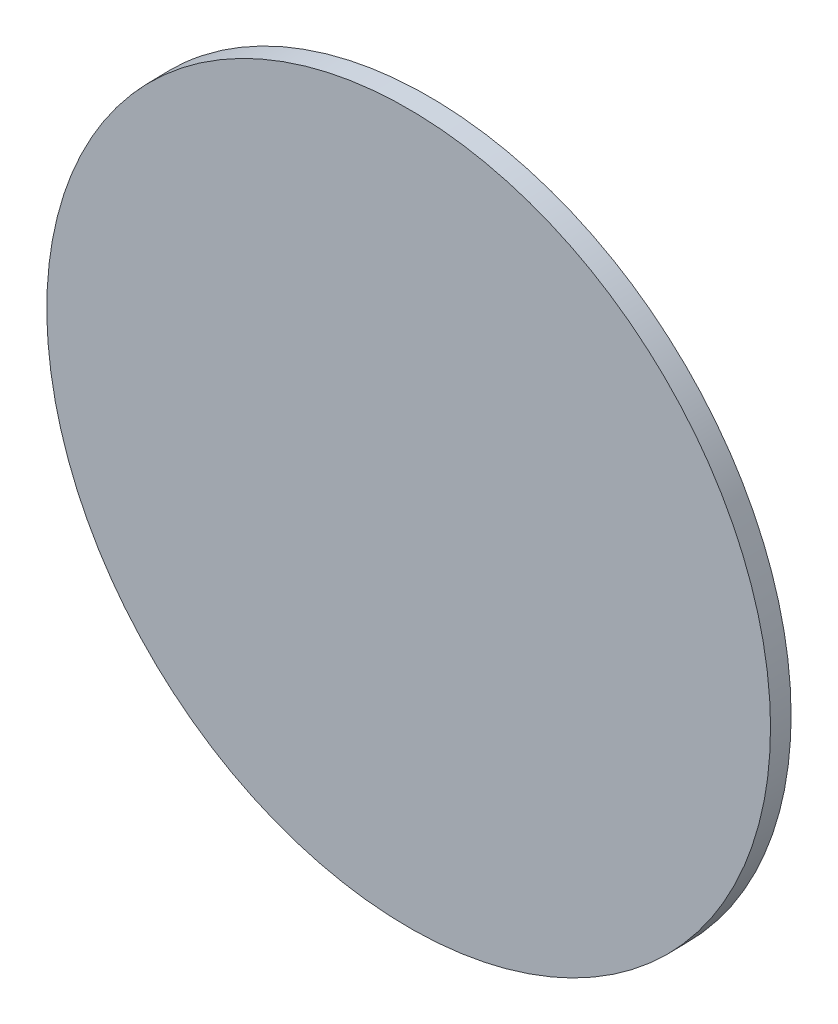
ISO-10303-21;
HEADER;
FILE_DESCRIPTION(('STEP AP214'),'2;1');
FILE_NAME('part.step','',(''),(''),'','','');
FILE_SCHEMA(('AUTOMOTIVE_DESIGN { 1 0 10303 214 1 1 1 1 }'));
ENDSEC;
DATA;
#1=APPLICATION_CONTEXT('core data for automotive mechanical design processes');
#2=APPLICATION_PROTOCOL_DEFINITION('international standard','automotive_design',2000,#1);
#3=PRODUCT_CONTEXT('',#1,'mechanical');
#4=PRODUCT('Part','Part','',(#3));
#5=PRODUCT_RELATED_PRODUCT_CATEGORY('part','',(#4));
#6=PRODUCT_DEFINITION_FORMATION('','',#4);
#7=PRODUCT_DEFINITION_CONTEXT('part definition',#1,'design');
#8=PRODUCT_DEFINITION('design','',#6,#7);
#9=PRODUCT_DEFINITION_SHAPE('','',#8);
#10=(LENGTH_UNIT() NAMED_UNIT(*) SI_UNIT(.MILLI.,.METRE.));
#11=(NAMED_UNIT(*) PLANE_ANGLE_UNIT() SI_UNIT($,.RADIAN.));
#12=(NAMED_UNIT(*) SI_UNIT($,.STERADIAN.) SOLID_ANGLE_UNIT());
#13=UNCERTAINTY_MEASURE_WITH_UNIT(LENGTH_MEASURE(1.E-05),#10,'distance_accuracy_value','');
#14=(GEOMETRIC_REPRESENTATION_CONTEXT(3) GLOBAL_UNCERTAINTY_ASSIGNED_CONTEXT((#13)) GLOBAL_UNIT_ASSIGNED_CONTEXT((#10,
#11,#12)) REPRESENTATION_CONTEXT('',''));
#15=CARTESIAN_POINT('',(0.,0.,0.));
#16=DIRECTION('',(0.,0.,1.));
#17=DIRECTION('',(1.,0.,0.));
#18=AXIS2_PLACEMENT_3D('',#15,#16,#17);
#19=CARTESIAN_POINT('',(85.7068958739331,-114.082851541454,61.8695362595294));
#20=CARTESIAN_POINT('',(86.9855501791155,-114.082715002272,61.8576769634676));
#21=CARTESIAN_POINT('',(89.5428587894805,-113.830574868088,61.836858182735));
#22=CARTESIAN_POINT('',(93.2314078014163,-112.711297905284,61.815529526912));
#23=CARTESIAN_POINT('',(96.6307940397738,-110.893967366935,61.8049200346468));
#24=CARTESIAN_POINT('',(99.6103809978107,-108.44842224646,61.8054374227773));
#25=CARTESIAN_POINT('',(102.055664819701,-105.46864347136,61.817061808368));
#26=CARTESIAN_POINT('',(103.872674619501,-102.069142268884,61.8393464727994));
#27=CARTESIAN_POINT('',(104.991583729595,-98.3805595637803,61.871435028915));
#28=CARTESIAN_POINT('',(105.369393100373,-94.5446455208251,61.9120943314986));
#29=CARTESIAN_POINT('',(104.991583729595,-90.7088121654839,61.959761866354));
#30=CARTESIAN_POINT('',(103.872674619501,-87.0204684224424,62.0126057968489));
#31=CARTESIAN_POINT('',(102.055664819701,-83.6213552732985,62.0685953603697));
#32=CARTESIAN_POINT('',(99.6103809978107,-80.6420987301293,62.1255789093895));
#33=CARTESIAN_POINT('',(96.6307940397738,-78.1971899511024,62.1813665980762));
#34=CARTESIAN_POINT('',(93.2314078014163,-76.3805854094754,62.2338145368398));
#35=CARTESIAN_POINT('',(89.5428587894805,-75.2620961990191,62.2809071808067));
#36=CARTESIAN_POINT('',(85.7068958739331,-74.8847052328356,62.320834786079));
#37=CARTESIAN_POINT('',(81.8709329583856,-75.262915434112,62.3520629571779));
#38=CARTESIAN_POINT('',(78.1823839464499,-76.3821923969159,62.3733916130009));
#39=CARTESIAN_POINT('',(74.7829977080924,-78.1995229352646,62.3840011052661));
#40=CARTESIAN_POINT('',(71.8034107500555,-80.64506805574,62.3834837171355));
#41=CARTESIAN_POINT('',(69.3581269281649,-83.6248468308397,62.3718593315449));
#42=CARTESIAN_POINT('',(67.541117128365,-87.024348033316,62.3495746671134));
#43=CARTESIAN_POINT('',(66.4222080182711,-90.7129307384197,62.3174861109978));
#44=CARTESIAN_POINT('',(66.0443986474928,-94.5488447813749,62.2768268084142));
#45=CARTESIAN_POINT('',(66.4222080182711,-98.3846781367161,62.2291592735589));
#46=CARTESIAN_POINT('',(67.541117128365,-102.073021879758,62.1763153430639));
#47=CARTESIAN_POINT('',(69.3581269281649,-105.472135028902,62.1203257795432));
#48=CARTESIAN_POINT('',(71.8034107500555,-108.451391572071,62.0633422305234));
#49=CARTESIAN_POINT('',(74.7829977080924,-110.896300351098,62.0075545418366));
#50=CARTESIAN_POINT('',(78.1823839464499,-112.712904892725,61.9551066030731));
#51=CARTESIAN_POINT('',(81.8709329583856,-113.831394103181,61.9080139591062));
#52=CARTESIAN_POINT('',(84.4282415687506,-114.082988080637,61.8813955555913));
#53=CARTESIAN_POINT('',(85.7068958739331,-114.082851541454,61.8695362595294));
#54=B_SPLINE_CURVE_WITH_KNOTS('',3,(#19,#20,#21,#22,#23,#24,#25,#26,#27,#28,#29,#30,#31,#32,#33,
#34,#35,#36,#37,#38,#39,#40,#41,#42,#43,#44,#45,#46,#47,#48,#49,#50,#51,#52,#53),.UNSPECIFIED.,
.T.,.F.,(4,1,1,1,1,1,1,1,1,1,1,1,1,1,1,1,1,1,1,1,1,1,1,1,1,1,1,1,1,1,1,1,4),(0.,0.03125,
0.0624999999999999,0.09375,0.125,0.15625,0.1875,0.21875,0.25,0.28125,0.3125,0.34375,0.375,
0.40625,0.4375,0.46875,0.5,0.53125,0.5625,0.59375,0.625,0.65625,0.6875,0.71875,0.75,0.78125,
0.8125,0.84375,0.875,0.90625,0.9375,0.96875,1.),.UNSPECIFIED.);
#55=DIRECTION('',(0.00927504161398903,-0.0115120037580994,0.999890717714957));
#56=VECTOR('',#55,1.);
#57=SURFACE_OF_LINEAR_EXTRUSION('',#54,#56);
#58=CARTESIAN_POINT('',(85.7068958739331,-114.082851541454,61.8695362595294));
#59=CARTESIAN_POINT('',(86.016874444642,-114.082818235632,61.8666612646174));
#60=CARTESIAN_POINT('',(86.3268509505105,-114.075384129447,61.8638714962122));
#61=CARTESIAN_POINT('',(86.946103894049,-114.045782949718,61.8584680777856));
#62=CARTESIAN_POINT('',(87.2553803263528,-114.023615763623,61.8558544291099));
#63=CARTESIAN_POINT('',(87.8725326212818,-113.964617041454,61.850808958023));
#64=CARTESIAN_POINT('',(88.1804084830238,-113.927785496135,61.8483771357264));
#65=CARTESIAN_POINT('',(88.7940613757493,-113.839528953054,61.8437009782443));
#66=CARTESIAN_POINT('',(89.0998384221305,-113.788104062473,61.8414566416819));
#67=CARTESIAN_POINT('',(89.7085911530925,-113.670721282911,61.8371612763618));
#68=CARTESIAN_POINT('',(90.0115668424944,-113.604763418947,61.8351102472712));
#69=CARTESIAN_POINT('',(90.6140397494619,-113.458506954127,61.8312055642477));
#70=CARTESIAN_POINT('',(90.9135369403105,-113.378208243204,61.8293519118299));
#71=CARTESIAN_POINT('',(91.5083810873808,-113.203476642742,61.8258458353011));
#72=CARTESIAN_POINT('',(91.8037280358141,-113.109043726682,61.8241934115677));
#73=CARTESIAN_POINT('',(92.3896005454006,-112.906249922882,61.8210936439426));
#74=CARTESIAN_POINT('',(92.6801261394355,-112.797889130174,61.8196462986517));
#75=CARTESIAN_POINT('',(93.2556774738459,-112.567431543691,61.8169607711952));
#76=CARTESIAN_POINT('',(93.5407032325866,-112.445334795794,61.815722588331));
#77=CARTESIAN_POINT('',(94.1046215391462,-112.187710669331,61.8134577449755));
#78=CARTESIAN_POINT('',(94.3835140414649,-112.052183191168,61.812431086053));
#79=CARTESIAN_POINT('',(94.9345487091208,-111.76803488667,61.8105911318546));
#80=CARTESIAN_POINT('',(95.2066908536853,-111.619414020049,61.8097778372352));
#81=CARTESIAN_POINT('',(95.7436065265374,-111.309411522335,61.8083665177128));
#82=CARTESIAN_POINT('',(96.0083800998016,-111.148029969154,61.8077684914955));
#83=CARTESIAN_POINT('',(96.5299302886891,-110.812825508086,61.8067898598582));
#84=CARTESIAN_POINT('',(96.7867069424623,-110.639002659565,61.8064092534009));
#85=CARTESIAN_POINT('',(97.2916908361091,-110.279322874428,61.8058660824521));
#86=CARTESIAN_POINT('',(97.5398980173427,-110.093465855489,61.8057035194525));
#87=CARTESIAN_POINT('',(98.0272055248016,-109.710172206982,61.8055961882347));
#88=CARTESIAN_POINT('',(98.2663058127553,-109.512735528759,61.8056514209317));
#89=CARTESIAN_POINT('',(98.734857249655,-109.106728394563,61.8059795783726));
#90=CARTESIAN_POINT('',(98.9643084489774,-108.898157996729,61.8062525019799));
#91=CARTESIAN_POINT('',(99.413008860506,-108.470319949354,61.8070161436525));
#92=CARTESIAN_POINT('',(99.6322581334334,-108.251052363497,61.8075068604213));
#93=CARTESIAN_POINT('',(100.060058216735,-107.802316705803,61.8087049743567));
#94=CARTESIAN_POINT('',(100.268608963416,-107.572848573252,61.809412372813));
#95=CARTESIAN_POINT('',(100.674575505975,-107.104264683341,61.8110415337769));
#96=CARTESIAN_POINT('',(100.871991243705,-106.865148875612,61.8119632974038));
#97=CARTESIAN_POINT('',(101.255241769409,-106.377811777065,61.8140190840003));
#98=CARTESIAN_POINT('',(101.441076606043,-106.129590524512,61.815153106078));
#99=CARTESIAN_POINT('',(101.800710831565,-105.624579972723,61.8176314378783));
#100=CARTESIAN_POINT('',(101.974510302785,-105.367790732117,61.8189757461622));
#101=CARTESIAN_POINT('',(102.309666865932,-104.846216884195,61.8218718316801));
#102=CARTESIAN_POINT('',(102.471023898488,-104.581432238737,61.8234236099039));
#103=CARTESIAN_POINT('',(102.780976271305,-104.044495955609,61.8267303626264));
#104=CARTESIAN_POINT('',(102.929571533648,-103.772344272973,61.8284853383655));
#105=CARTESIAN_POINT('',(103.21366760421,-103.221292084452,61.8321944556947));
#106=CARTESIAN_POINT('',(103.349168452718,-102.942391599335,61.8341485966718));
#107=CARTESIAN_POINT('',(103.606738352545,-102.378458904092,61.8382520688762));
#108=CARTESIAN_POINT('',(103.728807503469,-102.093426739455,61.8404013986557));
#109=CARTESIAN_POINT('',(103.959208989207,-101.51786418814,61.8448907841517));
#110=CARTESIAN_POINT('',(104.06754127814,-101.227333783102,61.847230840505));
#111=CARTESIAN_POINT('',(104.270277235675,-100.641453250582,61.8520956465915));
#112=CARTESIAN_POINT('',(104.364680809237,-100.346103090228,61.8546203975847));
#113=CARTESIAN_POINT('',(104.539352952513,-99.7512541267565,61.8598487810597));
#114=CARTESIAN_POINT('',(104.619621548748,-99.451755331424,61.8625524132059));
#115=CARTESIAN_POINT('',(104.765817080168,-98.8492808221408,61.8681327422143));
#116=CARTESIAN_POINT('',(104.831744125426,-98.5463051348946,61.8710094377481));
#117=CARTESIAN_POINT('',(104.949064626753,-97.9375540466324,61.8769298770311));
#118=CARTESIAN_POINT('',(105.000458057803,-97.6317786407978,61.8799736210678));
#119=CARTESIAN_POINT('',(105.088651131961,-97.0181305569105,61.88622062837));
#120=CARTESIAN_POINT('',(105.125450667884,-96.7102578634711,61.8894238928069));
#121=CARTESIAN_POINT('',(105.184384829585,-96.0931138001867,61.8959825575263));
#122=CARTESIAN_POINT('',(105.206519464609,-95.7838424312237,61.8993379577129));
#123=CARTESIAN_POINT('',(105.236055315263,-95.1646000974057,61.9061934807303));
#124=CARTESIAN_POINT('',(105.243456643447,-94.8546291379134,61.9096936024553));
#125=CARTESIAN_POINT('',(105.243456643447,-94.2346887996081,61.9168311379659));
#126=CARTESIAN_POINT('',(105.236055315263,-93.9247194207952,61.9204685517514));
#127=CARTESIAN_POINT('',(105.206519464609,-93.3054833948603,61.9278719545138));
#128=CARTESIAN_POINT('',(105.184384829585,-92.9962167531249,61.9316379444727));
#129=CARTESIAN_POINT('',(105.125450667884,-92.3790852762326,61.9392898173703));
#130=CARTESIAN_POINT('',(105.088651131961,-92.0712204419597,61.9431757003847));
#131=CARTESIAN_POINT('',(105.000458057803,-91.4575911932027,61.951058658503));
#132=CARTESIAN_POINT('',(104.949064626753,-91.151826763309,61.9550557327902));
#133=CARTESIAN_POINT('',(104.831744125426,-90.5431007308343,61.9631524265208));
#134=CARTESIAN_POINT('',(104.765817080168,-90.2401391234295,61.9672520457878));
#135=CARTESIAN_POINT('',(104.619621548748,-89.6376958366873,61.9755442509977));
#136=CARTESIAN_POINT('',(104.539352952513,-89.3382141840781,61.9797368376539));
#137=CARTESIAN_POINT('',(104.364680809237,-88.7434025248122,61.9882053285644));
#138=CARTESIAN_POINT('',(104.270277235675,-88.4480725259464,61.9924812329751));
#139=CARTESIAN_POINT('',(104.06754127814,-87.8622352911363,62.0011067204797));
#140=CARTESIAN_POINT('',(103.959208989206,-87.5717280223009,62.0054563030706));
#141=CARTESIAN_POINT('',(103.728807503469,-86.99621467714,62.0142195558993));
#142=CARTESIAN_POINT('',(103.606738352545,-86.7112085824447,62.0186332259231));
#143=CARTESIAN_POINT('',(103.349168452718,-86.1473308956329,62.0275145300814));
#144=CARTESIAN_POINT('',(103.21366760421,-85.8684593490261,62.0319821646159));
#145=CARTESIAN_POINT('',(102.929571533648,-85.3174678340506,62.0409611651295));
#146=CARTESIAN_POINT('',(102.780976271305,-85.0453478864585,62.0454725312431));
#147=CARTESIAN_POINT('',(102.471023898488,-84.5084777989294,62.0545287925535));
#148=CARTESIAN_POINT('',(102.309666865932,-84.2437276140087,62.0590736875455));
#149=CARTESIAN_POINT('',(101.974510302785,-83.7222253444688,62.0681868106056));
#150=CARTESIAN_POINT('',(101.800710831565,-83.4654732216942,62.0727550385623));
#151=CARTESIAN_POINT('',(101.441076606043,-82.960539475908,62.0819044600186));
#152=CARTESIAN_POINT('',(101.255241769409,-82.7123579115438,62.0864856536067));
#153=CARTESIAN_POINT('',(100.871991243705,-82.2251026626613,62.0956506040042));
#154=CARTESIAN_POINT('',(100.674575505975,-81.986029016419,62.1002343608243));
#155=CARTESIAN_POINT('',(100.268608963416,-81.5175318275649,62.109394059792));
#156=CARTESIAN_POINT('',(100.060058216735,-81.2881082345717,62.1139700019803));
#157=CARTESIAN_POINT('',(99.6322581334333,-80.8394639408576,62.1231036584975));
#158=CARTESIAN_POINT('',(99.413008860506,-80.6202431794102,62.1276613729348));
#159=CARTESIAN_POINT('',(98.9643084489773,-80.1925009596362,62.1367482510003));
#160=CARTESIAN_POINT('',(98.7348572496549,-79.9839795650072,62.1412774144583));
#161=CARTESIAN_POINT('',(98.2663058127552,-79.5780724979357,62.1502970379005));
#162=CARTESIAN_POINT('',(98.0272055248015,-79.3806868836443,62.1547874976824));
#163=CARTESIAN_POINT('',(97.5398980173426,-78.9974973079396,62.1637195510437));
#164=CARTESIAN_POINT('',(97.2916908361091,-78.8116932978636,62.1681611448283));
#165=CARTESIAN_POINT('',(96.7867069424622,-78.4521213606221,62.1769852492674));
#166=CARTESIAN_POINT('',(96.5299302886889,-78.2783533511205,62.1813677603259));
#167=CARTESIAN_POINT('',(96.0083800998017,-77.9432602759623,62.1900637030846));
#168=CARTESIAN_POINT('',(95.743606526538,-77.7819352696791,62.1943771344552));
#169=CARTESIAN_POINT('',(95.2066908536846,-77.4720474394342,62.2029254137059));
#170=CARTESIAN_POINT('',(94.9345487091185,-77.3234846933943,62.2071602611062));
#171=CARTESIAN_POINT('',(94.3835140414671,-77.039454071718,62.2155418081182));
#172=CARTESIAN_POINT('',(94.1046215391546,-76.9039861557914,62.2196885080011));
#173=CARTESIAN_POINT('',(93.540703232578,-76.6464824636662,62.2278841528717));
#174=CARTESIAN_POINT('',(93.2556774738142,-76.5244465878613,62.2319330985843));
#175=CARTESIAN_POINT('',(92.6801261394671,-76.2941119201622,62.2399238479688));
#176=CARTESIAN_POINT('',(92.3896005455188,-76.1858131741485,62.243865651283));
#177=CARTESIAN_POINT('',(91.8037280356959,-75.9831444933418,62.251633614708));
#178=CARTESIAN_POINT('',(91.5083810869395,-75.8887746535885,62.2554597740296));
#179=CARTESIAN_POINT('',(90.9135369407517,-75.7141700923578,62.2629878492897));
#180=CARTESIAN_POINT('',(90.6140397511084,-75.6339353443587,62.2666897654613));
#181=CARTESIAN_POINT('',(90.0115668408478,-75.4878075473044,62.2739607451133));
#182=CARTESIAN_POINT('',(89.7085911469472,-75.4219143881749,62.2775298096134));
#183=CARTESIAN_POINT('',(89.0998384282757,-75.3046616202217,62.2845265953417));
#184=CARTESIAN_POINT('',(88.7940613986834,-75.2533020364159,62.2879543163267));
#185=CARTESIAN_POINT('',(88.1804084600894,-75.1651765414511,62.2946612068423));
#186=CARTESIAN_POINT('',(87.8725325356891,-75.1284107374765,62.2979403752816));
#187=CARTESIAN_POINT('',(87.2553804119453,-75.0695438481231,62.3043428624414));
#188=CARTESIAN_POINT('',(86.9461042134846,-75.0474427534988,62.3074661812601));
#189=CARTESIAN_POINT('',(86.3268506310772,-75.0179737158513,62.3135496964992));
#190=CARTESIAN_POINT('',(86.0168732525051,-75.0106056602762,62.3165098941654));
#191=CARTESIAN_POINT('',(85.396918495361,-75.010671861215,62.3222598666014));
#192=CARTESIAN_POINT('',(85.0869411167889,-75.0181061177291,62.3250496413711));
#193=CARTESIAN_POINT('',(84.4676875343815,-75.0477074075066,62.3304530644568));
#194=CARTESIAN_POINT('',(84.1584113359208,-75.0698745533209,62.3330667114271));
#195=CARTESIAN_POINT('',(83.541259212177,-75.1288732460019,62.3381121812656));
#196=CARTESIAN_POINT('',(83.2333832877767,-75.1657048021142,62.3405440040191));
#197=CARTESIAN_POINT('',(82.6197303491827,-75.2539613530962,62.3452201618358));
#198=CARTESIAN_POINT('',(82.3139533195904,-75.305386240785,62.3474644982757));
#199=CARTESIAN_POINT('',(81.7052006009188,-75.4227690182303,62.3517598635063));
#200=CARTESIAN_POINT('',(81.4022249070183,-75.4887268829698,62.3538108926296));
#201=CARTESIAN_POINT('',(80.7997519967576,-75.6349833483563,62.3577155756771));
#202=CARTESIAN_POINT('',(80.5002548071144,-75.7152820590718,62.3595692280862));
#203=CARTESIAN_POINT('',(79.9054106609266,-75.8900136593824,62.3630753046085));
#204=CARTESIAN_POINT('',(79.6100637121702,-75.9844465754976,62.3647277283442));
#205=CARTESIAN_POINT('',(79.0241912023473,-76.1872403793387,62.3678274959711));
#206=CARTESIAN_POINT('',(78.733665608399,-76.295601172032,62.3692748412614));
#207=CARTESIAN_POINT('',(78.1581142740519,-76.526058758503,62.3719603687175));
#208=CARTESIAN_POINT('',(77.873088515288,-76.6481555064042,62.3731985515818));
#209=CARTESIAN_POINT('',(77.3091702087114,-76.9057796328706,62.3754633949374));
#210=CARTESIAN_POINT('',(77.0302777063989,-77.0413071110322,62.3764900538599));
#211=CARTESIAN_POINT('',(76.4792430387476,-77.3254554155295,62.3783300080583));
#212=CARTESIAN_POINT('',(76.2071008941815,-77.4740762821509,62.3791433026776));
#213=CARTESIAN_POINT('',(75.6701852213281,-77.7840787798654,62.3805546222001));
#214=CARTESIAN_POINT('',(75.4054116480643,-77.9454603330465,62.3811526484174));
#215=CARTESIAN_POINT('',(74.8838614591772,-78.2806647941139,62.3821312800546));
#216=CARTESIAN_POINT('',(74.6270848054039,-78.4544876426352,62.382511886512));
#217=CARTESIAN_POINT('',(74.122100911757,-78.814167427772,62.3830550574607));
#218=CARTESIAN_POINT('',(73.8738937305234,-79.0000244467112,62.3832176204603));
#219=CARTESIAN_POINT('',(73.3865862230645,-79.3833180952184,62.3833249516781));
#220=CARTESIAN_POINT('',(73.1474859351108,-79.5807547734411,62.3832697189812));
#221=CARTESIAN_POINT('',(72.6789344982112,-79.9867619076374,62.3829415615402));
#222=CARTESIAN_POINT('',(72.4494832988888,-80.1953323054707,62.3826686379329));
#223=CARTESIAN_POINT('',(72.0007828873601,-80.6231703528457,62.3819049962603));
#224=CARTESIAN_POINT('',(71.7815336144327,-80.8424379387026,62.3814142794915));
#225=CARTESIAN_POINT('',(71.3537335311314,-81.2911735963972,62.3802161655562));
#226=CARTESIAN_POINT('',(71.1451827844502,-81.5206417289478,62.3795087670999));
#227=CARTESIAN_POINT('',(70.7392162418915,-81.9892256188585,62.3778796061359));
#228=CARTESIAN_POINT('',(70.5418005041612,-82.2283414265877,62.376957842509));
#229=CARTESIAN_POINT('',(70.1585499784571,-82.7156785251354,62.3749020559125));
#230=CARTESIAN_POINT('',(69.9727151418235,-82.9638997776881,62.3737680338349));
#231=CARTESIAN_POINT('',(69.6130809163016,-83.4689103294771,62.3712897020345));
#232=CARTESIAN_POINT('',(69.4392814450813,-83.7256995700833,62.3699453937506));
#233=CARTESIAN_POINT('',(69.1041248819344,-84.2472734180051,62.3670493082328));
#234=CARTESIAN_POINT('',(68.9427678493783,-84.5120580634632,62.365497530009));
#235=CARTESIAN_POINT('',(68.6328154765607,-85.0489943465908,62.3621907772865));
#236=CARTESIAN_POINT('',(68.484220214218,-85.3211460292273,62.3604358015473));
#237=CARTESIAN_POINT('',(68.2001241436564,-85.8721982177484,62.3567266842182));
#238=CARTESIAN_POINT('',(68.0646232951486,-86.1510987028649,62.354772543241));
#239=CARTESIAN_POINT('',(67.8070533953207,-86.7150313981076,62.3506690710367));
#240=CARTESIAN_POINT('',(67.6849842443969,-87.0000635627452,62.3485197412571));
#241=CARTESIAN_POINT('',(67.4545827586596,-87.5756261140604,62.3440303557612));
#242=CARTESIAN_POINT('',(67.3462504697258,-87.8661565190978,62.3416902994078));
#243=CARTESIAN_POINT('',(67.1435145121915,-88.4520370516181,62.3368254933213));
#244=CARTESIAN_POINT('',(67.0491109386295,-88.7473872119719,62.3343007423281));
#245=CARTESIAN_POINT('',(66.8744387953535,-89.3422361754435,62.3290723588531));
#246=CARTESIAN_POINT('',(66.7941701991181,-89.641734970776,62.326368726707));
#247=CARTESIAN_POINT('',(66.6479746676983,-90.2442094800593,62.3207883976985));
#248=CARTESIAN_POINT('',(66.5820476224399,-90.5471851673054,62.3179117021647));
#249=CARTESIAN_POINT('',(66.4647271211135,-91.1559362555676,62.3119912628818));
#250=CARTESIAN_POINT('',(66.4133336900635,-91.4617116614022,62.308947518845));
#251=CARTESIAN_POINT('',(66.3251406159053,-92.0753597452895,62.3027005115428));
#252=CARTESIAN_POINT('',(66.2883410799824,-92.3832324387289,62.2994972471059));
#253=CARTESIAN_POINT('',(66.229406918281,-93.0003765020133,62.2929385823865));
#254=CARTESIAN_POINT('',(66.2072722832568,-93.3096478709764,62.2895831821999));
#255=CARTESIAN_POINT('',(66.1777364326028,-93.9288902047943,62.2827276591825));
#256=CARTESIAN_POINT('',(66.1703351044189,-94.2388611642866,62.2792275374575));
#257=CARTESIAN_POINT('',(66.1703351044189,-94.8588015025919,62.272090001947));
#258=CARTESIAN_POINT('',(66.1777364326028,-95.1687708814048,62.2684525881614));
#259=CARTESIAN_POINT('',(66.2072722832568,-95.7880069073397,62.261049185399));
#260=CARTESIAN_POINT('',(66.229406918281,-96.0972735490751,62.2572831954402));
#261=CARTESIAN_POINT('',(66.2883410799824,-96.7144050259674,62.2496313225425));
#262=CARTESIAN_POINT('',(66.3251406159054,-97.0222698602403,62.2457454395281));
#263=CARTESIAN_POINT('',(66.4133336900635,-97.6358991089974,62.2378624814098));
#264=CARTESIAN_POINT('',(66.4647271211136,-97.941663538891,62.2338654071227));
#265=CARTESIAN_POINT('',(66.58204762244,-98.5503895713657,62.225768713392));
#266=CARTESIAN_POINT('',(66.6479746676983,-98.8533511787706,62.221669094125));
#267=CARTESIAN_POINT('',(66.7941701991182,-99.4557944655127,62.2133768889151));
#268=CARTESIAN_POINT('',(66.8744387953535,-99.7552761181219,62.209184302259));
#269=CARTESIAN_POINT('',(67.0491109386295,-100.350087777388,62.2007158113484));
#270=CARTESIAN_POINT('',(67.1435145121916,-100.645417776254,62.1964399069377));
#271=CARTESIAN_POINT('',(67.3462504697259,-101.231255011064,62.1878144194332));
#272=CARTESIAN_POINT('',(67.4545827586597,-101.521762279899,62.1834648368423));
#273=CARTESIAN_POINT('',(67.6849842443969,-102.09727562506,62.1747015840135));
#274=CARTESIAN_POINT('',(67.8070533953207,-102.382281719755,62.1702879139897));
#275=CARTESIAN_POINT('',(68.0646232951487,-102.946159406567,62.1614066098314));
#276=CARTESIAN_POINT('',(68.2001241436565,-103.225030953174,62.1569389752969));
#277=CARTESIAN_POINT('',(68.4842202142181,-103.776022468149,62.1479599747833));
#278=CARTESIAN_POINT('',(68.6328154765608,-104.048142415742,62.1434486086697));
#279=CARTESIAN_POINT('',(68.9427678493784,-104.585012503271,62.1343923473593));
#280=CARTESIAN_POINT('',(69.1041248819345,-104.849762688191,62.1298474523674));
#281=CARTESIAN_POINT('',(69.4392814450814,-105.371264957731,62.1207343293073));
#282=CARTESIAN_POINT('',(69.6130809163016,-105.628017080506,62.1161661013505));
#283=CARTESIAN_POINT('',(69.9727151418236,-106.132950826292,62.1070166798942));
#284=CARTESIAN_POINT('',(70.1585499784572,-106.381132390656,62.1024354863062));
#285=CARTESIAN_POINT('',(70.5418005041613,-106.868387639539,62.0932705359087));
#286=CARTESIAN_POINT('',(70.7392162418916,-107.107461285781,62.0886867790885));
#287=CARTESIAN_POINT('',(71.1451827844503,-107.575958474635,62.0795270801208));
#288=CARTESIAN_POINT('',(71.3537335311315,-107.805382067628,62.0749511379326));
#289=CARTESIAN_POINT('',(71.7815336144328,-108.254026361342,62.0658174814154));
#290=CARTESIAN_POINT('',(72.0007828873602,-108.47324712279,62.061259766978));
#291=CARTESIAN_POINT('',(72.4494832988889,-108.900989342564,62.0521728889126));
#292=CARTESIAN_POINT('',(72.6789344982113,-109.109510737193,62.0476437254545));
#293=CARTESIAN_POINT('',(73.1474859351109,-109.515417804264,62.0386241020124));
#294=CARTESIAN_POINT('',(73.3865862230646,-109.712803418556,62.0341336422304));
#295=CARTESIAN_POINT('',(73.8738937305236,-110.09599299426,62.0252015888692));
#296=CARTESIAN_POINT('',(74.1221009117571,-110.281797004336,62.0207599950846));
#297=CARTESIAN_POINT('',(74.6270848054039,-110.641368941578,62.0119358906455));
#298=CARTESIAN_POINT('',(74.8838614591771,-110.815136951079,62.007553379587));
#299=CARTESIAN_POINT('',(75.4054116480646,-111.150230026238,61.9988574368282));
#300=CARTESIAN_POINT('',(75.6701852213288,-111.311555032521,61.9945440054577));
#301=CARTESIAN_POINT('',(76.2071008941809,-111.621442862766,61.9859957262069));
#302=CARTESIAN_POINT('',(76.4792430387454,-111.770005608805,61.9817608788066));
#303=CARTESIAN_POINT('',(77.0302777064013,-112.054036230482,61.9733793317946));
#304=CARTESIAN_POINT('',(77.30917020872,-112.18950414641,61.9692326319117));
#305=CARTESIAN_POINT('',(77.8730885152797,-112.447007838532,61.9610369870412));
#306=CARTESIAN_POINT('',(78.1581142740203,-112.569043714333,61.9569880413289));
#307=CARTESIAN_POINT('',(78.7336656084307,-112.799378382043,61.9489972919436));
#308=CARTESIAN_POINT('',(79.0241912024656,-112.907677128072,61.9450554886285));
#309=CARTESIAN_POINT('',(79.6100637120521,-113.110345808838,61.9372875252062));
#310=CARTESIAN_POINT('',(79.9054106604855,-113.204715648536,61.9334613658882));
#311=CARTESIAN_POINT('',(80.5002548075557,-113.379320209918,61.9259332906182));
#312=CARTESIAN_POINT('',(80.7997519984043,-113.459554958125,61.922231374433));
#313=CARTESIAN_POINT('',(81.4022249053718,-113.605682754612,61.914960394818));
#314=CARTESIAN_POINT('',(81.7052005947737,-113.671575912968,61.9113913303687));
#315=CARTESIAN_POINT('',(82.3139533257357,-113.788828683035,61.9043945445019));
#316=CARTESIAN_POINT('',(82.6197303721169,-113.84018826973,61.9009668233279));
#317=CARTESIAN_POINT('',(83.2333832648424,-113.928313756803,61.8942599333287));
#318=CARTESIAN_POINT('',(83.5412591265844,-113.965079549998,61.8909807655947));
#319=CARTESIAN_POINT('',(84.1584114215134,-114.023946468802,61.884578276508));
#320=CARTESIAN_POINT('',(84.4676878538172,-114.046047603658,61.8814549550569));
#321=CARTESIAN_POINT('',(85.0869407973558,-114.075516531393,61.8753714470095));
#322=CARTESIAN_POINT('',(85.3969173032242,-114.082884436826,61.8724112591671));
#323=CARTESIAN_POINT('',(85.7068958739331,-114.082851541454,61.8695362595294));
#324=B_SPLINE_CURVE_WITH_KNOTS('',3,(#58,#59,#60,#61,#62,#63,#64,#65,#66,#67,#68,#69,#70,#71,
#72,#73,#74,#75,#76,#77,#78,#79,#80,#81,#82,#83,#84,#85,#86,#87,#88,#89,#90,#91,#92,#93,#94,#95,
#96,#97,#98,#99,#100,#101,#102,#103,#104,#105,#106,#107,#108,#109,#110,#111,#112,#113,#114,#115,
#116,#117,#118,#119,#120,#121,#122,#123,#124,#125,#126,#127,#128,#129,#130,#131,#132,#133,#134,
#135,#136,#137,#138,#139,#140,#141,#142,#143,#144,#145,#146,#147,#148,#149,#150,#151,#152,#153,
#154,#155,#156,#157,#158,#159,#160,#161,#162,#163,#164,#165,#166,#167,#168,#169,#170,#171,#172,
#173,#174,#175,#176,#177,#178,#179,#180,#181,#182,#183,#184,#185,#186,#187,#188,#189,#190,#191,
#192,#193,#194,#195,#196,#197,#198,#199,#200,#201,#202,#203,#204,#205,#206,#207,#208,#209,#210,
#211,#212,#213,#214,#215,#216,#217,#218,#219,#220,#221,#222,#223,#224,#225,#226,#227,#228,#229,
#230,#231,#232,#233,#234,#235,#236,#237,#238,#239,#240,#241,#242,#243,#244,#245,#246,#247,#248,
#249,#250,#251,#252,#253,#254,#255,#256,#257,#258,#259,#260,#261,#262,#263,#264,#265,#266,#267,
#268,#269,#270,#271,#272,#273,#274,#275,#276,#277,#278,#279,#280,#281,#282,#283,#284,#285,#286,
#287,#288,#289,#290,#291,#292,#293,#294,#295,#296,#297,#298,#299,#300,#301,#302,#303,#304,#305,
#306,#307,#308,#309,#310,#311,#312,#313,#314,#315,#316,#317,#318,#319,#320,#321,#322,#323),
.UNSPECIFIED.,.F.,.F.,(4,2,2,2,2,2,2,2,2,2,2,2,2,2,2,2,2,2,2,2,2,2,2,2,2,2,2,2,2,2,2,2,2,2,2,2,
2,2,2,2,2,2,2,2,2,2,2,2,2,2,2,2,2,2,2,2,2,2,2,2,2,2,2,2,2,2,2,2,2,2,2,2,2,2,2,2,2,2,2,2,2,2,2,2,
2,2,2,2,2,2,2,2,2,2,2,2,2,2,2,2,2,2,2,2,2,2,2,2,2,2,2,2,2,2,2,2,2,2,2,2,2,2,2,2,2,2,2,2,2,2,2,2,
4),(0.,0.929884678488245,1.85977646084456,2.78966882947028,3.71955436865832,4.64943830716197,
5.57932938299301,6.50922220359943,7.43910867969417,8.36899205015762,9.29888231674858,
10.2287754445224,11.1586628951395,12.0885459089833,13.0184352846687,13.9483285677804,
14.8782169954525,15.8080998877902,16.7379883154623,17.6678815985739,18.5977709742593,
19.5276539881032,20.4575414387203,21.3874345664941,22.3173248330851,23.2472082035485,
24.1770946796433,25.1069875002497,26.0368785760807,26.9667625145843,27.8966480537724,
28.8265404223981,29.7564322047544,30.6863168832427,31.6162015617309,32.5460933440872,
33.4759857127129,34.405871251901,35.3357551904047,36.2656462662357,37.1955390868421,
38.1254255629369,39.0553089334003,39.9851991999912,40.9150923277651,41.8449797783821,
42.774862792226,43.7047521679114,44.6346454510231,45.5645338786952,46.4944167710329,
47.424305198705,48.3541984818166,49.2840878575021,50.2139708713459,51.143858321963,
52.0737514497368,53.0036417163278,53.9335250867912,54.8634115628859,55.7933043834924,
56.7231954593234,57.653079397827,58.5829649370151,59.5128573056408,60.4427490879971,
61.3726337664854,62.3025184449736,63.2324102273299,64.1623025959556,65.0921881351437,
66.0220720736473,66.9519631494784,67.8818559700848,68.8117424461795,69.741625816643,
70.6715160832339,71.6014092110078,72.5312966616248,73.4611796754687,74.3910690511541,
75.3209623342657,76.2508507619378,77.1807336542755,78.1106220819476,79.0405153650593,
79.9704047407447,80.9002877545886,81.8301752052056,82.7600683329795,83.6899585995704,
84.6198419700339,85.5497284461286,86.479621266735,87.4095123425661,88.3393962810697,
89.2692818202578,90.1991741888835,91.1290659712398,92.058950649728,92.9888353282163,
93.9187271105726,94.8486194791983,95.7785050183864,96.70838895689,97.638280032721,
98.5681728533275,99.4980593294222,100.427942699886,101.357832966477,102.28772609425,
103.217613544868,104.147496558711,105.077385934397,106.007279217508,106.937167645181,
107.867050537518,108.79693896519,109.726832248302,110.656721623987,111.586604637831,
112.516492088448,113.446385216222,114.376275482813,115.306158853277,116.236045329371,
117.165938149978,118.095829225809,119.025713164312,119.9555987035,120.885491072126,
121.815382854482,122.745267532971),.UNSPECIFIED.);
#325=CARTESIAN_POINT('',(85.7068958739331,-114.082851541454,61.8695362595294));
#326=VERTEX_POINT('',#325);
#327=EDGE_CURVE('E9',#326,#326,#324,.T.);
#328=ORIENTED_EDGE('',*,*,#327,.T.);
#329=EDGE_LOOP('',(#328));
#330=FACE_BOUND('',#329,.T.);
#331=CARTESIAN_POINT('',(85.7173955214618,-114.095883502586,63.0014449387796));
#332=CARTESIAN_POINT('',(85.3977299823162,-114.095917571287,63.0044097817635));
#333=CARTESIAN_POINT('',(85.0780667696557,-114.088080832856,63.0074652218311));
#334=CARTESIAN_POINT('',(84.4395081161258,-114.056741322461,63.0137493472206));
#335=CARTESIAN_POINT('',(84.1206126812397,-114.033238428805,63.016978033888));
#336=CARTESIAN_POINT('',(83.4843576921203,-113.970642190515,63.0236006572551));
#337=CARTESIAN_POINT('',(83.166998137887,-113.93154884588,63.0269945939547));
#338=CARTESIAN_POINT('',(82.5345810681738,-113.837846766422,63.0339397462667));
#339=CARTESIAN_POINT('',(82.2195235348313,-113.783238152122,63.0374909606571));
#340=CARTESIAN_POINT('',(81.592479644868,-113.658581228412,63.044742662287));
#341=CARTESIAN_POINT('',(81.2804932882471,-113.588532919002,63.0484431495266));
#342=CARTESIAN_POINT('',(80.6603311452559,-113.433221043224,63.0559839541842));
#343=CARTESIAN_POINT('',(80.3521553885046,-113.34795735867,63.0598242726883));
#344=CARTESIAN_POINT('',(79.7403515062713,-113.162438327189,63.0676353285533));
#345=CARTESIAN_POINT('',(79.4367233807895,-113.062182980264,63.0716060659141));
#346=CARTESIAN_POINT('',(78.8347519469323,-112.846903813672,63.0796685516753));
#347=CARTESIAN_POINT('',(78.5364085975238,-112.731880108731,63.0837602991354));
#348=CARTESIAN_POINT('',(77.9457461816262,-112.487288488592,63.0920553637765));
#349=CARTESIAN_POINT('',(77.6534271151371,-112.357720573394,63.0962586809576));
#350=CARTESIAN_POINT('',(77.0754946786124,-112.084404915617,63.1047663689755));
#351=CARTESIAN_POINT('',(76.7898813606834,-111.940657062898,63.109070740597));
#352=CARTESIAN_POINT('',(76.2260396744955,-111.639344621164,63.1177700563429));
#353=CARTESIAN_POINT('',(75.9478113062366,-111.481780032148,63.1221650004671));
#354=CARTESIAN_POINT('',(75.3994189840086,-111.153196838584,63.1310349823676));
#355=CARTESIAN_POINT('',(75.1292549674134,-110.982178338554,63.1355100195214));
#356=CARTESIAN_POINT('',(74.5976728372691,-110.627051540105,63.1445296726264));
#357=CARTESIAN_POINT('',(74.3362547237201,-110.442943241685,63.1490742885776));
#358=CARTESIAN_POINT('',(73.8227616167622,-110.062127169542,63.1582219142402));
#359=CARTESIAN_POINT('',(73.5706866959454,-109.865419297957,63.162824924405));
#360=CARTESIAN_POINT('',(73.0764753246128,-109.459892714077,63.1720781902159));
#361=CARTESIAN_POINT('',(72.8343388740971,-109.251074001782,63.176728445862));
#362=CARTESIAN_POINT('',(72.3606000731633,-108.821814049116,63.1860650554691));
#363=CARTESIAN_POINT('',(72.1289976409327,-108.60137289904,63.1907514091495));
#364=CARTESIAN_POINT('',(71.6769241996179,-108.149358245984,63.2001490305085));
#365=CARTESIAN_POINT('',(71.4564531905336,-107.917784743003,63.2048602981871));
#366=CARTESIAN_POINT('',(71.0271326652916,-107.444102804582,63.2142963233701));
#367=CARTESIAN_POINT('',(70.8182832394217,-107.201994287322,63.219021080979));
#368=CARTESIAN_POINT('',(70.4126944487828,-106.707837720493,63.2284726990392));
#369=CARTESIAN_POINT('',(70.2159550840137,-106.455789670925,63.2331995594905));
#370=CARTESIAN_POINT('',(69.8350753208195,-105.942349178406,63.2426439961331));
#371=CARTESIAN_POINT('',(69.6509348245397,-105.680956808057,63.2473615723963));
#372=CARTESIAN_POINT('',(69.2957430008779,-105.149424970018,63.2567760166907));
#373=CARTESIAN_POINT('',(69.1246916734959,-104.879285502327,63.261472884722));
#374=CARTESIAN_POINT('',(68.7960422769893,-104.330941028878,63.2708346882694));
#375=CARTESIAN_POINT('',(68.6384443123784,-104.052735960484,63.2754996235371));
#376=CARTESIAN_POINT('',(68.3370646522005,-103.488939570444,63.2847863734651));
#377=CARTESIAN_POINT('',(68.1932829566335,-103.203348248797,63.2894081881253));
#378=CARTESIAN_POINT('',(67.9198992268786,-102.625458446613,63.2985975073997));
#379=CARTESIAN_POINT('',(67.7902970825544,-102.333160018193,63.3031650124354));
#380=CARTESIAN_POINT('',(67.5456366991351,-101.74253746562,63.3122344878508));
#381=CARTESIAN_POINT('',(67.4305784600401,-101.444213341467,63.3167364582304));
#382=CARTESIAN_POINT('',(67.2152300042679,-100.84227890359,63.325664271282));
#383=CARTESIAN_POINT('',(67.1149399023141,-100.538668548821,63.3300901133623));
#384=CARTESIAN_POINT('',(66.9293512239221,-99.9268987146578,63.3388551105664));
#385=CARTESIAN_POINT('',(66.844052647484,-99.6187392352626,63.3431942656901));
#386=CARTESIAN_POINT('',(66.6886709345877,-98.9986081044264,63.35177532721));
#387=CARTESIAN_POINT('',(66.6185876799437,-98.6866364826162,63.3560172343613));
#388=CARTESIAN_POINT('',(66.4938608980946,-98.0596205089797,63.3643932060435));
#389=CARTESIAN_POINT('',(66.4392173708895,-97.7445761571534,63.3685272705745));
#390=CARTESIAN_POINT('',(66.3454455762383,-97.1121837577271,63.3766780022815));
#391=CARTESIAN_POINT('',(66.3063174293162,-96.7948356922513,63.3806946685453));
#392=CARTESIAN_POINT('',(66.2436518015416,-96.158602385607,63.3886010790984));
#393=CARTESIAN_POINT('',(66.2201143206889,-95.8397171444384,63.3924908233877));
#394=CARTESIAN_POINT('',(66.1887058567386,-95.2011759765344,63.4001338617712));
#395=CARTESIAN_POINT('',(66.1808347519477,-94.8815200558048,63.4038871569251));
#396=CARTESIAN_POINT('',(66.1808347519477,-94.2422065333374,63.4112477409797));
#397=CARTESIAN_POINT('',(66.1887058567386,-93.9225489315995,63.4148550298805));
#398=CARTESIAN_POINT('',(66.2201143206889,-93.2840010558841,63.4219154521944));
#399=CARTESIAN_POINT('',(66.2436518015416,-92.9651107878864,63.4253685844098));
#400=CARTESIAN_POINT('',(66.3063174293162,-92.3288640979318,63.4321125693884));
#401=CARTESIAN_POINT('',(66.3454455762383,-92.0115076759751,63.4354034221515));
#402=CARTESIAN_POINT('',(66.4392173708895,-91.3790952499879,63.4418147197198));
#403=CARTESIAN_POINT('',(66.4938608980946,-91.0640392281074,63.4449351658484));
#404=CARTESIAN_POINT('',(66.6185876799436,-90.4369966169462,63.4509974991582));
#405=CARTESIAN_POINT('',(66.6886709345876,-90.1250100276656,63.4539393863394));
#406=CARTESIAN_POINT('',(66.844052647484,-89.5048457124231,63.4596381711901));
#407=CARTESIAN_POINT('',(66.9293512239221,-89.1966680160668,63.4623950674226));
#408=CARTESIAN_POINT('',(67.114939902314,-88.5848585462859,63.4677174592659));
#409=CARTESIAN_POINT('',(67.2152300042679,-88.2812267728612,63.4702829548768));
#410=CARTESIAN_POINT('',(67.4305784600401,-87.6792463436605,63.4752161290598));
#411=CARTESIAN_POINT('',(67.5456366991351,-87.3808976468645,63.4775838091684));
#412=CARTESIAN_POINT('',(67.7902970825544,-86.7902228429071,63.482114919664));
#413=CARTESIAN_POINT('',(67.9198992268786,-86.4978967357456,63.484278350051));
#414=CARTESIAN_POINT('',(68.1932829566334,-85.9199485478186,63.4883964963327));
#415=CARTESIAN_POINT('',(68.3370646522005,-85.6343265191467,63.4903512106061));
#416=CARTESIAN_POINT('',(68.6384443123784,-85.0704657643563,63.4940474727806));
#417=CARTESIAN_POINT('',(68.7960422769893,-84.7922270382377,63.4957890206816));
#418=CARTESIAN_POINT('',(69.1246916734959,-84.2438123761232,63.499054492362));
#419=CARTESIAN_POINT('',(69.2957430008779,-83.9736363775137,63.5005784178318));
#420=CARTESIAN_POINT('',(69.6509348245397,-83.4420286822217,63.5034041774779));
#421=CARTESIAN_POINT('',(69.8350753208195,-83.1805969855393,63.5047060116542));
#422=CARTESIAN_POINT('',(70.2159550840136,-82.6670751496727,63.5070852613148));
#423=CARTESIAN_POINT('',(70.4126944487827,-82.4149850830684,63.5081626750559));
#424=CARTESIAN_POINT('',(70.8182832394217,-81.9207418958584,63.5100907622789));
#425=CARTESIAN_POINT('',(71.0271326652915,-81.6785887752526,63.5109414357609));
#426=CARTESIAN_POINT('',(71.4564531905335,-81.2048151481349,63.5124137146934));
#427=CARTESIAN_POINT('',(71.6769241996178,-80.9731945598219,63.5130353219232));
#428=CARTESIAN_POINT('',(72.1289976409327,-80.5210833587966,63.5140471383613));
#429=CARTESIAN_POINT('',(72.3606000731632,-80.3005927460841,63.5144373475696));
#430=CARTESIAN_POINT('',(72.834338874097,-79.8712316184439,63.514986267379));
#431=CARTESIAN_POINT('',(73.0764753246128,-79.6623611937931,63.5151449761818));
#432=CARTESIAN_POINT('',(73.5706866959453,-79.2567290626731,63.5152307931427));
#433=CARTESIAN_POINT('',(73.8227616167621,-79.059967356204,63.5151579013008));
#434=CARTESIAN_POINT('',(74.3362547237201,-78.6790416188778,63.5147804086317));
#435=CARTESIAN_POINT('',(74.5976728372693,-78.4948774901761,63.5144758096043));
#436=CARTESIAN_POINT('',(75.1292549674132,-78.1396371633258,63.5136347992962));
#437=CARTESIAN_POINT('',(75.3994189840079,-77.9685609651772,63.5130983880154));
#438=CARTESIAN_POINT('',(75.9478113062373,-77.6398606531102,63.511795883293));
#439=CARTESIAN_POINT('',(76.226039674498,-77.4822366436963,63.5110297880673));
#440=CARTESIAN_POINT('',(76.7898813606808,-77.1808037839842,63.5092700368685));
#441=CARTESIAN_POINT('',(77.0754946786028,-77.0369949336861,63.5082763808953));
#442=CARTESIAN_POINT('',(77.6534271151467,-76.7635558486113,63.5060636234561));
#443=CARTESIAN_POINT('',(77.9457461816619,-76.6339255037063,63.5048445237413));
#444=CARTESIAN_POINT('',(78.5364085974881,-76.3892077375708,63.5021830062414));
#445=CARTESIAN_POINT('',(78.8347519467991,-76.2741203163405,63.5007405884563));
#446=CARTESIAN_POINT('',(79.4367233809226,-76.0587125885021,63.4976367137283));
#447=CARTESIAN_POINT('',(79.7403515067684,-75.9583923966103,63.4959752550839));
#448=CARTESIAN_POINT('',(80.3521553880074,-75.7727427040594,63.492437561977));
#449=CARTESIAN_POINT('',(80.6603311434006,-75.6874132034003,63.4905613275144));
#450=CARTESIAN_POINT('',(81.2804932901023,-75.5319688812698,63.4865983403326));
#451=CARTESIAN_POINT('',(81.5924796517918,-75.4618539416187,63.4845115892487));
#452=CARTESIAN_POINT('',(82.2195235279074,-75.3370631027115,63.480131845182));
#453=CARTESIAN_POINT('',(82.5345810423335,-75.2823872034554,63.4778388521991));
#454=CARTESIAN_POINT('',(83.1669981637274,-75.1885500580243,63.4730528876305));
#455=CARTESIAN_POINT('',(83.4843577885586,-75.1493889323689,63.4705599144915));
#456=CARTESIAN_POINT('',(84.1206125848014,-75.0866568205503,63.4653802310386));
#457=CARTESIAN_POINT('',(84.439507756213,-75.0630858343872,63.4626935207247));
#458=CARTESIAN_POINT('',(85.0780671295657,-75.0316099133265,63.4571325991752));
#459=CARTESIAN_POINT('',(85.3977313255137,-75.0237048567391,63.4542583893962));
#460=CARTESIAN_POINT('',(86.0370597174099,-75.0236365870157,63.4483287298709));
#461=CARTESIAN_POINT('',(86.356723913358,-75.0314733738797,63.4452732801246));
#462=CARTESIAN_POINT('',(86.9952832867106,-75.0628129197305,63.4389891476498));
#463=CARTESIAN_POINT('',(87.3141784581222,-75.0863158004084,63.4357604635758));
#464=CARTESIAN_POINT('',(87.9504332543651,-75.1489120291988,63.4291378421073));
#465=CARTESIAN_POINT('',(88.2677928791962,-75.1880053773112,63.4257439047128));
#466=CARTESIAN_POINT('',(88.9002100005901,-75.2817074593147,63.4187987518921));
#467=CARTESIAN_POINT('',(89.2152675150162,-75.3363160726826,63.4152475376879));
#468=CARTESIAN_POINT('',(89.8423113911318,-75.4609729957102,63.4079958361942));
#469=CARTESIAN_POINT('',(90.1542977528213,-75.53102130537,63.4042953489048));
#470=CARTESIAN_POINT('',(90.774459899523,-75.686333181331,63.3967545442106));
#471=CARTESIAN_POINT('',(91.0826356549162,-75.7715968658185,63.3929142257199));
#472=CARTESIAN_POINT('',(91.6944395361552,-75.9571158972498,63.3851031698647));
#473=CARTESIAN_POINT('',(91.998067662001,-76.0573712441935,63.3811324325003));
#474=CARTESIAN_POINT('',(92.6000390961245,-76.2726504107985,63.3730699467365));
#475=CARTESIAN_POINT('',(92.8983824454355,-76.3876741157348,63.3689781992774));
#476=CARTESIAN_POINT('',(93.4890448612617,-76.6322657358699,63.3606831346369));
#477=CARTESIAN_POINT('',(93.781363927777,-76.7618336510688,63.3564798174556));
#478=CARTESIAN_POINT('',(94.3592963643209,-77.0351493088467,63.3479721294375));
#479=CARTESIAN_POINT('',(94.6449096822428,-77.1788971615653,63.343667757816));
#480=CARTESIAN_POINT('',(95.2087513684256,-77.4802096032999,63.3349684420703));
#481=CARTESIAN_POINT('',(95.4869797366864,-77.6377741923158,63.330573497946));
#482=CARTESIAN_POINT('',(96.0353720589157,-77.9663573858796,63.3217035160455));
#483=CARTESIAN_POINT('',(96.3055360755105,-78.1373758859095,63.3172284788916));
#484=CARTESIAN_POINT('',(96.8371182056543,-78.4925026843589,63.3082088257867));
#485=CARTESIAN_POINT('',(97.0985363192035,-78.6766109827784,63.3036642098355));
#486=CARTESIAN_POINT('',(97.6120294261615,-79.0574270549221,63.2945165841729));
#487=CARTESIAN_POINT('',(97.8641043469783,-79.2541349265066,63.2899135740081));
#488=CARTESIAN_POINT('',(98.3583157183108,-79.6596615103864,63.2806603081972));
#489=CARTESIAN_POINT('',(98.6004521688266,-79.8684802226819,63.2760100525511));
#490=CARTESIAN_POINT('',(99.0741909697604,-80.2977401753475,63.266673442944));
#491=CARTESIAN_POINT('',(99.3057934019909,-80.5181813254232,63.2619870892636));
#492=CARTESIAN_POINT('',(99.7578668433058,-80.9701959784799,63.2525894679046));
#493=CARTESIAN_POINT('',(99.9783378523901,-81.2017694814607,63.247878200226));
#494=CARTESIAN_POINT('',(100.407658377632,-81.6754514198818,63.238442175043));
#495=CARTESIAN_POINT('',(100.616507803502,-81.9175599371422,63.2337174174341));
#496=CARTESIAN_POINT('',(101.022096594141,-82.4117165039709,63.2242657993739));
#497=CARTESIAN_POINT('',(101.21883595891,-82.6637645535392,63.2195389389226));
#498=CARTESIAN_POINT('',(101.599715722104,-83.1772050460573,63.21009450228));
#499=CARTESIAN_POINT('',(101.783856218384,-83.4385974164063,63.2053769260169));
#500=CARTESIAN_POINT('',(102.139048042046,-83.9701292544459,63.1959624817224));
#501=CARTESIAN_POINT('',(102.310099369428,-84.2402687221366,63.1912656136911));
#502=CARTESIAN_POINT('',(102.638748765934,-84.7886131955854,63.1819038101437));
#503=CARTESIAN_POINT('',(102.796346730545,-85.0668182639794,63.177238874876));
#504=CARTESIAN_POINT('',(103.097726390723,-85.6306146540199,63.1679521249481));
#505=CARTESIAN_POINT('',(103.24150808629,-85.9162059756663,63.1633303102878));
#506=CARTESIAN_POINT('',(103.514891816045,-86.4940957778503,63.1541409910134));
#507=CARTESIAN_POINT('',(103.644493960369,-86.7863942062705,63.1495734859777));
#508=CARTESIAN_POINT('',(103.889154343789,-87.3770167588438,63.1405040105623));
#509=CARTESIAN_POINT('',(104.004212582884,-87.6753408829968,63.1360020401827));
#510=CARTESIAN_POINT('',(104.219561038656,-88.2772753208738,63.1270742271311));
#511=CARTESIAN_POINT('',(104.31985114061,-88.5808856756423,63.1226483850508));
#512=CARTESIAN_POINT('',(104.505439819002,-89.1926555098059,63.1138833878467));
#513=CARTESIAN_POINT('',(104.59073839544,-89.5008149892011,63.109544232723));
#514=CARTESIAN_POINT('',(104.746120108336,-90.1209461200373,63.1009631712031));
#515=CARTESIAN_POINT('',(104.81620336298,-90.4329177418475,63.0967212640518));
#516=CARTESIAN_POINT('',(104.940930144829,-91.059933715484,63.0883452923696));
#517=CARTESIAN_POINT('',(104.995573672034,-91.3749780673103,63.0842112278386));
#518=CARTESIAN_POINT('',(105.089345466685,-92.0073704667366,63.0760604961317));
#519=CARTESIAN_POINT('',(105.128473613607,-92.3247185322124,63.0720438298678));
#520=CARTESIAN_POINT('',(105.191139241382,-92.9609518388567,63.0641374193147));
#521=CARTESIAN_POINT('',(105.214676722235,-93.2798370800253,63.0602476750254));
#522=CARTESIAN_POINT('',(105.246085186185,-93.9183782479293,63.0526046366419));
#523=CARTESIAN_POINT('',(105.253956290976,-94.2380341686589,63.0488513414881));
#524=CARTESIAN_POINT('',(105.253956290976,-94.8773476911263,63.0414907574334));
#525=CARTESIAN_POINT('',(105.246085186185,-95.1970052928642,63.0378834685326));
#526=CARTESIAN_POINT('',(105.214676722235,-95.8355531685796,63.0308230462187));
#527=CARTESIAN_POINT('',(105.191139241382,-96.1544434365773,63.0273699140033));
#528=CARTESIAN_POINT('',(105.128473613607,-96.7906901265319,63.0206259290247));
#529=CARTESIAN_POINT('',(105.089345466685,-97.1080465484886,63.0173350762616));
#530=CARTESIAN_POINT('',(104.995573672034,-97.7404589744758,63.0109237786933));
#531=CARTESIAN_POINT('',(104.940930144829,-98.0555149963563,63.0078033325647));
#532=CARTESIAN_POINT('',(104.81620336298,-98.6825576075175,63.0017409992549));
#533=CARTESIAN_POINT('',(104.746120108336,-98.9945441967981,62.9987991120737));
#534=CARTESIAN_POINT('',(104.59073839544,-99.6147085120406,62.993100327223));
#535=CARTESIAN_POINT('',(104.505439819002,-99.9228862083969,62.9903434309905));
#536=CARTESIAN_POINT('',(104.31985114061,-100.534695678178,62.9850210391472));
#537=CARTESIAN_POINT('',(104.219561038656,-100.838327451602,62.9824555435363));
#538=CARTESIAN_POINT('',(104.004212582884,-101.440307880803,62.9775223693533));
#539=CARTESIAN_POINT('',(103.889154343789,-101.738656577599,62.9751546892447));
#540=CARTESIAN_POINT('',(103.644493960369,-102.329331381557,62.9706235787491));
#541=CARTESIAN_POINT('',(103.514891816045,-102.621657488718,62.9684601483622));
#542=CARTESIAN_POINT('',(103.24150808629,-103.199605676645,62.9643420020804));
#543=CARTESIAN_POINT('',(103.097726390723,-103.485227705317,62.962387287807));
#544=CARTESIAN_POINT('',(102.796346730545,-104.049088460107,62.9586910256326));
#545=CARTESIAN_POINT('',(102.638748765934,-104.327327186226,62.9569494777316));
#546=CARTESIAN_POINT('',(102.310099369428,-104.87574184834,62.9536840060511));
#547=CARTESIAN_POINT('',(102.139048042046,-105.14591784695,62.9521600805813));
#548=CARTESIAN_POINT('',(101.783856218384,-105.677525542242,62.9493343209352));
#549=CARTESIAN_POINT('',(101.599715722104,-105.938957238924,62.9480324867589));
#550=CARTESIAN_POINT('',(101.21883595891,-106.452479074791,62.9456532370983));
#551=CARTESIAN_POINT('',(101.022096594141,-106.704569141395,62.9445758233572));
#552=CARTESIAN_POINT('',(100.616507803502,-107.198812328605,62.9426477361342));
#553=CARTESIAN_POINT('',(100.407658377632,-107.440965449211,62.9417970626522));
#554=CARTESIAN_POINT('',(99.9783378523901,-107.914739076329,62.9403247837197));
#555=CARTESIAN_POINT('',(99.7578668433058,-108.146359664642,62.9397031764899));
#556=CARTESIAN_POINT('',(99.3057934019909,-108.598470865667,62.9386913600518));
#557=CARTESIAN_POINT('',(99.0741909697604,-108.81896147838,62.9383011508435));
#558=CARTESIAN_POINT('',(98.6004521688266,-109.24832260602,62.9377522310341));
#559=CARTESIAN_POINT('',(98.3583157183109,-109.457193030671,62.9375935222313));
#560=CARTESIAN_POINT('',(97.8641043469783,-109.862825161791,62.9375077052704));
#561=CARTESIAN_POINT('',(97.6120294261615,-110.05958686826,62.9375805971123));
#562=CARTESIAN_POINT('',(97.0985363192036,-110.440512605586,62.9379580897814));
#563=CARTESIAN_POINT('',(96.8371182056546,-110.624676734288,62.9382626888088));
#564=CARTESIAN_POINT('',(96.3055360755103,-110.979917061138,62.9391036991169));
#565=CARTESIAN_POINT('',(96.035372058915,-111.150993259286,62.9396401103977));
#566=CARTESIAN_POINT('',(95.4869797366871,-111.479693571353,62.9409426151201));
#567=CARTESIAN_POINT('',(95.2087513684282,-111.637317580767,62.9417087103457));
#568=CARTESIAN_POINT('',(94.6449096822403,-111.93875044048,62.9434684615446));
#569=CARTESIAN_POINT('',(94.3592963643113,-112.082559290778,62.9444621175179));
#570=CARTESIAN_POINT('',(93.7813639277865,-112.355998375852,62.9466748749569));
#571=CARTESIAN_POINT('',(93.4890448612975,-112.485628720756,62.9478939746715));
#572=CARTESIAN_POINT('',(92.8983824453999,-112.730346486895,62.950555492172));
#573=CARTESIAN_POINT('',(92.6000390959913,-112.84543390813,62.9519979099579));
#574=CARTESIAN_POINT('',(91.9980676621342,-113.060841635955,62.9551017846837));
#575=CARTESIAN_POINT('',(91.6944395366523,-113.161161827829,62.9567632433248));
#576=CARTESIAN_POINT('',(91.0826356544191,-113.346811520429,62.9603009364404));
#577=CARTESIAN_POINT('',(90.7744598976677,-113.432141021155,62.9621771709149));
#578=CARTESIAN_POINT('',(90.1542977546766,-113.587585343102,62.9661401580644));
#579=CARTESIAN_POINT('',(89.8423113980557,-113.657700282502,62.9682269091041));
#580=CARTESIAN_POINT('',(89.2152675080923,-113.782491122095,62.9726066532914));
#581=CARTESIAN_POINT('',(88.9002099747498,-113.837167022287,62.974899646439));
#582=CARTESIAN_POINT('',(88.2677929050367,-113.931004165161,62.9796856105576));
#583=CARTESIAN_POINT('',(87.9504333508033,-113.970165287324,62.982178583082));
#584=CARTESIAN_POINT('',(87.3141783616839,-114.032897408684,62.9873582682142));
#585=CARTESIAN_POINT('',(86.9952829267978,-114.056468407881,62.990044980822));
#586=CARTESIAN_POINT('',(86.356724273268,-114.087944293333,62.9956058961044));
#587=CARTESIAN_POINT('',(86.0370610606074,-114.095849301277,62.9984800973224));
#588=CARTESIAN_POINT('',(85.7173955214618,-114.095883502586,63.0014449387796));
#589=B_SPLINE_CURVE_WITH_KNOTS('',3,(#331,#332,#333,#334,#335,#336,#337,#338,#339,#340,#341,
#342,#343,#344,#345,#346,#347,#348,#349,#350,#351,#352,#353,#354,#355,#356,#357,#358,#359,#360,
#361,#362,#363,#364,#365,#366,#367,#368,#369,#370,#371,#372,#373,#374,#375,#376,#377,#378,#379,
#380,#381,#382,#383,#384,#385,#386,#387,#388,#389,#390,#391,#392,#393,#394,#395,#396,#397,#398,
#399,#400,#401,#402,#403,#404,#405,#406,#407,#408,#409,#410,#411,#412,#413,#414,#415,#416,#417,
#418,#419,#420,#421,#422,#423,#424,#425,#426,#427,#428,#429,#430,#431,#432,#433,#434,#435,#436,
#437,#438,#439,#440,#441,#442,#443,#444,#445,#446,#447,#448,#449,#450,#451,#452,#453,#454,#455,
#456,#457,#458,#459,#460,#461,#462,#463,#464,#465,#466,#467,#468,#469,#470,#471,#472,#473,#474,
#475,#476,#477,#478,#479,#480,#481,#482,#483,#484,#485,#486,#487,#488,#489,#490,#491,#492,#493,
#494,#495,#496,#497,#498,#499,#500,#501,#502,#503,#504,#505,#506,#507,#508,#509,#510,#511,#512,
#513,#514,#515,#516,#517,#518,#519,#520,#521,#522,#523,#524,#525,#526,#527,#528,#529,#530,#531,
#532,#533,#534,#535,#536,#537,#538,#539,#540,#541,#542,#543,#544,#545,#546,#547,#548,#549,#550,
#551,#552,#553,#554,#555,#556,#557,#558,#559,#560,#561,#562,#563,#564,#565,#566,#567,#568,#569,
#570,#571,#572,#573,#574,#575,#576,#577,#578,#579,#580,#581,#582,#583,#584,#585,#586,#587,#588),
.UNSPECIFIED.,.F.,.F.,(4,2,2,2,2,2,2,2,2,2,2,2,2,2,2,2,2,2,2,2,2,2,2,2,2,2,2,2,2,2,2,2,2,2,2,2,
2,2,2,2,2,2,2,2,2,2,2,2,2,2,2,2,2,2,2,2,2,2,2,2,2,2,2,2,2,2,2,2,2,2,2,2,2,2,2,2,2,2,2,2,2,2,2,2,
2,2,2,2,2,2,2,2,2,2,2,2,2,2,2,2,2,2,2,2,2,2,2,2,2,2,2,2,2,2,2,2,2,2,2,2,2,2,2,2,2,2,2,2,4),(0.,
0.958937939115197,1.91788332715283,2.87682871519048,3.83576665430568,4.79470459342087,
5.7536499814585,6.71259536949613,7.67153330861133,8.63047124772654,9.58941663576418,
10.5483620238018,11.507299962917,12.4662379020322,13.4251832900698,14.3841286781075,
15.3430666172227,16.3020045563379,17.2609499443755,18.2198953324132,19.1788332715283,
20.1377712106436,21.0967165986812,22.0556619867188,23.0145999258341,23.9735378649493,
24.9324832529869,25.8914286410245,26.8503665801397,27.8093045192549,28.7682499072926,
29.7271952953302,30.6861332344454,31.6450711735606,32.6040165615983,33.5629619496359,
34.5218998887511,35.4808378278663,36.439783215904,37.3987286039416,38.3576665430568,
39.316604482172,40.2755498702096,41.2344952582473,42.1934331973625,43.1523711364777,
44.1113165245153,45.0702619125529,46.0291998516681,46.9881377907833,47.947083178821,
48.9060285668586,49.8649665059738,50.823904445089,51.7828498331267,52.7417952211643,
53.7007331602795,54.6596710993947,55.6186164874324,56.57756187547,57.5364998145852,
58.4954377537004,59.454383141738,60.4133285297757,61.3722664688909,62.3312044080061,
63.2901497960437,64.2490951840814,65.2080331231966,66.1669710623118,67.1259164503494,
68.084861838387,69.0437997775022,70.0027377166174,70.9616831046551,71.9206284926927,
72.8795664318079,73.8385043709231,74.7974497589608,75.7563951469984,76.7153330861136,
77.6742710252288,78.6332164132665,79.5921618013041,80.5510997404193,81.5100376795345,
82.4689830675721,83.4279284556098,84.386866394725,85.3458043338402,86.3047497218778,
87.2636951099154,88.2226330490307,89.1815709881459,90.1405163761835,91.0994617642211,
92.0583997033363,93.0173376424515,93.9762830304892,94.9352284185268,95.894166357642,
96.8531042967573,97.8120496847949,98.7709950728325,99.7299330119477,100.688870951063,
101.647816339101,102.606761727138,103.565699666253,104.524637605369,105.483582993406,
106.442528381444,107.401466320559,108.360404259674,109.319349647712,110.27829503575,
111.237232974865,112.19617091398,113.155116302018,114.114061690055,115.07299962917,
116.031937568286,116.990882956323,117.949828344361,118.908766283476,119.867704222591,
120.826649610629,121.785594998667,122.744532937782),.UNSPECIFIED.);
#590=CARTESIAN_POINT('',(85.7173955214618,-114.095883502586,63.0014449387796));
#591=VERTEX_POINT('',#590);
#592=EDGE_CURVE('E24',#591,#591,#589,.F.);
#593=ORIENTED_EDGE('',*,*,#592,.F.);
#594=EDGE_LOOP('',(#593));
#595=FACE_BOUND('',#594,.T.);
#596=ADVANCED_FACE('F14',(#330,#595),#57,.T.);
#597=CARTESIAN_POINT('',(85.5145516566454,-113.544532910089,61.8775182585474));
#598=DIRECTION('',(0.00927504161398903,-0.0115120037580994,0.999890717714957));
#599=DIRECTION('',(0.778704898567832,0.627390373648227,0.));
#600=AXIS2_PLACEMENT_3D('',#597,#598,#599);
#601=PLANE('',#600);
#602=ORIENTED_EDGE('',*,*,#327,.F.);
#603=EDGE_LOOP('',(#602));
#604=FACE_BOUND('',#603,.T.);
#605=ADVANCED_FACE('F65',(#604),#601,.F.);
#606=CARTESIAN_POINT('',(85.5250513041742,-113.557564871221,63.0094269377975));
#607=DIRECTION('',(0.00927504161398903,-0.0115120037580994,0.999890717714957));
#608=DIRECTION('',(0.778704898567832,0.627390373648227,0.));
#609=AXIS2_PLACEMENT_3D('',#606,#607,#608);
#610=PLANE('',#609);
#611=ORIENTED_EDGE('',*,*,#592,.T.);
#612=EDGE_LOOP('',(#611));
#613=FACE_BOUND('',#612,.T.);
#614=ADVANCED_FACE('F33',(#613),#610,.T.);
#615=CLOSED_SHELL('',(#596,#605,#614));
#616=MANIFOLD_SOLID_BREP('B1',#615);
#617=ADVANCED_BREP_SHAPE_REPRESENTATION('',(#18,#616),#14);
#618=SHAPE_DEFINITION_REPRESENTATION(#9,#617);
ENDSEC;
END-ISO-10303-21;
